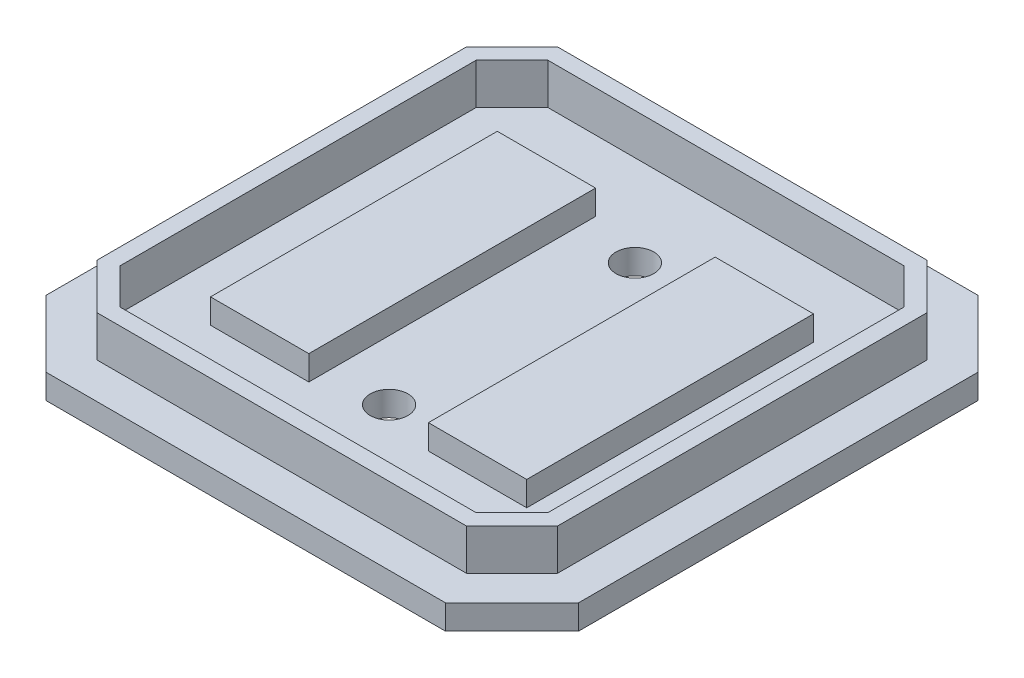
ISO-10303-21;
HEADER;
FILE_DESCRIPTION(('STEP AP214'),'2;1');
FILE_NAME('part.step','',(''),(''),'','','');
FILE_SCHEMA(('AUTOMOTIVE_DESIGN { 1 0 10303 214 1 1 1 1 }'));
ENDSEC;
DATA;
#1=APPLICATION_CONTEXT('core data for automotive mechanical design processes');
#2=APPLICATION_PROTOCOL_DEFINITION('international standard','automotive_design',2000,#1);
#3=PRODUCT_CONTEXT('',#1,'mechanical');
#4=PRODUCT('Part','Part','',(#3));
#5=PRODUCT_RELATED_PRODUCT_CATEGORY('part','',(#4));
#6=PRODUCT_DEFINITION_FORMATION('','',#4);
#7=PRODUCT_DEFINITION_CONTEXT('part definition',#1,'design');
#8=PRODUCT_DEFINITION('design','',#6,#7);
#9=PRODUCT_DEFINITION_SHAPE('','',#8);
#10=(LENGTH_UNIT() NAMED_UNIT(*) SI_UNIT(.MILLI.,.METRE.));
#11=(NAMED_UNIT(*) PLANE_ANGLE_UNIT() SI_UNIT($,.RADIAN.));
#12=(NAMED_UNIT(*) SI_UNIT($,.STERADIAN.) SOLID_ANGLE_UNIT());
#13=UNCERTAINTY_MEASURE_WITH_UNIT(LENGTH_MEASURE(1.E-05),#10,'distance_accuracy_value','');
#14=(GEOMETRIC_REPRESENTATION_CONTEXT(3) GLOBAL_UNCERTAINTY_ASSIGNED_CONTEXT((#13)) GLOBAL_UNIT_ASSIGNED_CONTEXT((#10,
#11,#12)) REPRESENTATION_CONTEXT('',''));
#15=CARTESIAN_POINT('',(0.,0.,0.));
#16=DIRECTION('',(0.,0.,1.));
#17=DIRECTION('',(1.,0.,0.));
#18=AXIS2_PLACEMENT_3D('',#15,#16,#17);
#19=CARTESIAN_POINT('',(0.,3.,0.));
#20=DIRECTION('',(0.,-1.,0.));
#21=DIRECTION('',(0.,0.,-1.));
#22=AXIS2_PLACEMENT_3D('',#19,#20,#21);
#23=PLANE('',#22);
#24=CARTESIAN_POINT('',(0.,3.,-15.));
#25=DIRECTION('',(0.,1.,0.));
#26=DIRECTION('',(0.,0.,1.));
#27=AXIS2_PLACEMENT_3D('',#24,#25,#26);
#28=CIRCLE('',#27,2.3);
#29=CARTESIAN_POINT('',(0.,3.,-12.7));
#30=VERTEX_POINT('',#29);
#31=EDGE_CURVE('E878',#30,#30,#28,.T.);
#32=ORIENTED_EDGE('',*,*,#31,.F.);
#33=EDGE_LOOP('',(#32));
#34=FACE_BOUND('',#33,.T.);
#35=CARTESIAN_POINT('',(0.,3.,15.));
#36=DIRECTION('',(0.,1.,0.));
#37=DIRECTION('',(0.,0.,1.));
#38=AXIS2_PLACEMENT_3D('',#35,#36,#37);
#39=CIRCLE('',#38,2.3);
#40=CARTESIAN_POINT('',(0.,3.,17.3));
#41=VERTEX_POINT('',#40);
#42=EDGE_CURVE('E883',#41,#41,#39,.T.);
#43=ORIENTED_EDGE('',*,*,#42,.F.);
#44=EDGE_LOOP('',(#43));
#45=FACE_BOUND('',#44,.T.);
#46=DIRECTION('',(1.,0.,0.));
#47=VECTOR('',#46,1.);
#48=CARTESIAN_POINT('',(19.296722284252,3.,-17.5));
#49=LINE('',#48,#47);
#50=CARTESIAN_POINT('',(7.29672228425205,3.,-17.5));
#51=VERTEX_POINT('',#50);
#52=CARTESIAN_POINT('',(19.296722284252,3.,-17.5));
#53=VERTEX_POINT('',#52);
#54=EDGE_CURVE('E276',#51,#53,#49,.T.);
#55=ORIENTED_EDGE('',*,*,#54,.T.);
#56=DIRECTION('',(0.,0.,1.));
#57=VECTOR('',#56,1.);
#58=CARTESIAN_POINT('',(19.296722284252,3.,-17.5));
#59=LINE('',#58,#57);
#60=CARTESIAN_POINT('',(19.296722284252,3.,17.5));
#61=VERTEX_POINT('',#60);
#62=EDGE_CURVE('E249',#53,#61,#59,.T.);
#63=ORIENTED_EDGE('',*,*,#62,.T.);
#64=DIRECTION('',(-1.,0.,0.));
#65=VECTOR('',#64,1.);
#66=CARTESIAN_POINT('',(19.296722284252,3.,17.5));
#67=LINE('',#66,#65);
#68=CARTESIAN_POINT('',(7.29672228425204,3.,17.5));
#69=VERTEX_POINT('',#68);
#70=EDGE_CURVE('E265',#61,#69,#67,.T.);
#71=ORIENTED_EDGE('',*,*,#70,.T.);
#72=DIRECTION('',(0.,0.,-1.));
#73=VECTOR('',#72,1.);
#74=CARTESIAN_POINT('',(7.29672228425205,3.,-17.5));
#75=LINE('',#74,#73);
#76=EDGE_CURVE('E50',#69,#51,#75,.T.);
#77=ORIENTED_EDGE('',*,*,#76,.T.);
#78=EDGE_LOOP('',(#55,#63,#71,#77));
#79=FACE_BOUND('',#78,.T.);
#80=DIRECTION('',(-1.,0.,0.));
#81=VECTOR('',#80,1.);
#82=CARTESIAN_POINT('',(0.,3.,-26.1));
#83=LINE('',#82,#81);
#84=CARTESIAN_POINT('',(21.7240332008121,3.,-26.1));
#85=VERTEX_POINT('',#84);
#86=CARTESIAN_POINT('',(-21.7240332008122,3.,-26.1));
#87=VERTEX_POINT('',#86);
#88=EDGE_CURVE('E361',#85,#87,#83,.T.);
#89=ORIENTED_EDGE('',*,*,#88,.T.);
#90=DIRECTION('',(-0.707106781186548,0.,0.707106781186548));
#91=VECTOR('',#90,1.);
#92=CARTESIAN_POINT('',(-23.9120166004061,3.,-23.9120166004061));
#93=LINE('',#92,#91);
#94=CARTESIAN_POINT('',(-26.1,3.,-21.7240332008122));
#95=VERTEX_POINT('',#94);
#96=EDGE_CURVE('E315',#87,#95,#93,.T.);
#97=ORIENTED_EDGE('',*,*,#96,.T.);
#98=DIRECTION('',(0.,0.,1.));
#99=VECTOR('',#98,1.);
#100=CARTESIAN_POINT('',(-26.1,3.,0.));
#101=LINE('',#100,#99);
#102=CARTESIAN_POINT('',(-26.1,3.,21.7240332008122));
#103=VERTEX_POINT('',#102);
#104=EDGE_CURVE('E379',#95,#103,#101,.T.);
#105=ORIENTED_EDGE('',*,*,#104,.T.);
#106=DIRECTION('',(0.707106781186548,0.,0.707106781186548));
#107=VECTOR('',#106,1.);
#108=CARTESIAN_POINT('',(-23.9120166004061,3.,23.9120166004061));
#109=LINE('',#108,#107);
#110=CARTESIAN_POINT('',(-21.7240332008122,3.,26.1));
#111=VERTEX_POINT('',#110);
#112=EDGE_CURVE('E376',#103,#111,#109,.T.);
#113=ORIENTED_EDGE('',*,*,#112,.T.);
#114=DIRECTION('',(1.,0.,0.));
#115=VECTOR('',#114,1.);
#116=CARTESIAN_POINT('',(0.,3.,26.1));
#117=LINE('',#116,#115);
#118=CARTESIAN_POINT('',(21.7240332008122,3.,26.1));
#119=VERTEX_POINT('',#118);
#120=EDGE_CURVE('E373',#111,#119,#117,.T.);
#121=ORIENTED_EDGE('',*,*,#120,.T.);
#122=DIRECTION('',(0.707106781186548,0.,-0.707106781186548));
#123=VECTOR('',#122,1.);
#124=CARTESIAN_POINT('',(23.9120166004061,3.,23.9120166004061));
#125=LINE('',#124,#123);
#126=CARTESIAN_POINT('',(26.1,3.,21.7240332008122));
#127=VERTEX_POINT('',#126);
#128=EDGE_CURVE('E370',#119,#127,#125,.T.);
#129=ORIENTED_EDGE('',*,*,#128,.T.);
#130=DIRECTION('',(0.,0.,-1.));
#131=VECTOR('',#130,1.);
#132=CARTESIAN_POINT('',(26.1,3.,0.));
#133=LINE('',#132,#131);
#134=CARTESIAN_POINT('',(26.1,3.,-21.7240332008122));
#135=VERTEX_POINT('',#134);
#136=EDGE_CURVE('E367',#127,#135,#133,.T.);
#137=ORIENTED_EDGE('',*,*,#136,.T.);
#138=DIRECTION('',(-0.707106781186548,0.,-0.707106781186547));
#139=VECTOR('',#138,1.);
#140=CARTESIAN_POINT('',(23.9120166004061,3.,-23.9120166004061));
#141=LINE('',#140,#139);
#142=EDGE_CURVE('E364',#135,#85,#141,.T.);
#143=ORIENTED_EDGE('',*,*,#142,.T.);
#144=EDGE_LOOP('',(#89,#97,#105,#113,#121,#129,#137,#143));
#145=FACE_BOUND('',#144,.T.);
#146=DIRECTION('',(0.,0.,1.));
#147=VECTOR('',#146,1.);
#148=CARTESIAN_POINT('',(-19.296722284252,3.,-17.5));
#149=LINE('',#148,#147);
#150=CARTESIAN_POINT('',(-19.296722284252,3.,-17.5));
#151=VERTEX_POINT('',#150);
#152=CARTESIAN_POINT('',(-19.296722284252,3.,17.5));
#153=VERTEX_POINT('',#152);
#154=EDGE_CURVE('E254',#151,#153,#149,.T.);
#155=ORIENTED_EDGE('',*,*,#154,.F.);
#156=DIRECTION('',(-1.,0.,0.));
#157=VECTOR('',#156,1.);
#158=CARTESIAN_POINT('',(-19.296722284252,3.,-17.5));
#159=LINE('',#158,#157);
#160=CARTESIAN_POINT('',(-7.29672228425205,3.,-17.5));
#161=VERTEX_POINT('',#160);
#162=EDGE_CURVE('E290',#161,#151,#159,.T.);
#163=ORIENTED_EDGE('',*,*,#162,.F.);
#164=DIRECTION('',(0.,0.,-1.));
#165=VECTOR('',#164,1.);
#166=CARTESIAN_POINT('',(-7.29672228425205,3.,-17.5));
#167=LINE('',#166,#165);
#168=CARTESIAN_POINT('',(-7.29672228425204,3.,17.5));
#169=VERTEX_POINT('',#168);
#170=EDGE_CURVE('E300',#169,#161,#167,.T.);
#171=ORIENTED_EDGE('',*,*,#170,.F.);
#172=DIRECTION('',(1.,0.,0.));
#173=VECTOR('',#172,1.);
#174=CARTESIAN_POINT('',(-19.296722284252,3.,17.5));
#175=LINE('',#174,#173);
#176=EDGE_CURVE('E58',#153,#169,#175,.T.);
#177=ORIENTED_EDGE('',*,*,#176,.F.);
#178=EDGE_LOOP('',(#155,#163,#171,#177));
#179=FACE_BOUND('',#178,.T.);
#180=ADVANCED_FACE('F35',(#34,#45,#79,#145,#179),#23,.F.);
#181=DIRECTION('',(0.,0.,1.));
#182=VECTOR('',#181,1.);
#183=CARTESIAN_POINT('',(-32.5,3.,32.5));
#184=LINE('',#183,#182);
#185=CARTESIAN_POINT('',(-32.5,3.,-24.375));
#186=VERTEX_POINT('',#185);
#187=CARTESIAN_POINT('',(-32.5,3.,24.375));
#188=VERTEX_POINT('',#187);
#189=EDGE_CURVE('E453',#186,#188,#184,.T.);
#190=ORIENTED_EDGE('',*,*,#189,.T.);
#191=DIRECTION('',(-0.707106781186546,0.,-0.707106781186549));
#192=VECTOR('',#191,1.);
#193=CARTESIAN_POINT('',(-24.375,3.,32.5));
#194=LINE('',#193,#192);
#195=CARTESIAN_POINT('',(-24.375,3.,32.5));
#196=VERTEX_POINT('',#195);
#197=EDGE_CURVE('E493',#188,#196,#194,.F.);
#198=ORIENTED_EDGE('',*,*,#197,.T.);
#199=DIRECTION('',(1.,0.,0.));
#200=VECTOR('',#199,1.);
#201=CARTESIAN_POINT('',(-32.5,3.,32.5));
#202=LINE('',#201,#200);
#203=CARTESIAN_POINT('',(24.375,3.,32.5));
#204=VERTEX_POINT('',#203);
#205=EDGE_CURVE('E456',#196,#204,#202,.T.);
#206=ORIENTED_EDGE('',*,*,#205,.T.);
#207=DIRECTION('',(-0.707106781186549,0.,0.707106781186546));
#208=VECTOR('',#207,1.);
#209=CARTESIAN_POINT('',(32.5,3.,24.375));
#210=LINE('',#209,#208);
#211=CARTESIAN_POINT('',(32.5,3.,24.375));
#212=VERTEX_POINT('',#211);
#213=EDGE_CURVE('E487',#204,#212,#210,.F.);
#214=ORIENTED_EDGE('',*,*,#213,.T.);
#215=DIRECTION('',(0.,0.,-1.));
#216=VECTOR('',#215,1.);
#217=CARTESIAN_POINT('',(32.5,3.,32.5));
#218=LINE('',#217,#216);
#219=CARTESIAN_POINT('',(32.5,3.,-24.375));
#220=VERTEX_POINT('',#219);
#221=EDGE_CURVE('E446',#212,#220,#218,.T.);
#222=ORIENTED_EDGE('',*,*,#221,.T.);
#223=DIRECTION('',(0.707106781186546,0.,0.707106781186549));
#224=VECTOR('',#223,1.);
#225=CARTESIAN_POINT('',(24.375,3.,-32.5));
#226=LINE('',#225,#224);
#227=CARTESIAN_POINT('',(24.375,3.,-32.5));
#228=VERTEX_POINT('',#227);
#229=EDGE_CURVE('E489',#220,#228,#226,.F.);
#230=ORIENTED_EDGE('',*,*,#229,.T.);
#231=DIRECTION('',(-1.,0.,0.));
#232=VECTOR('',#231,1.);
#233=CARTESIAN_POINT('',(-32.5,3.,-32.5));
#234=LINE('',#233,#232);
#235=CARTESIAN_POINT('',(-24.375,3.,-32.5));
#236=VERTEX_POINT('',#235);
#237=EDGE_CURVE('E449',#228,#236,#234,.T.);
#238=ORIENTED_EDGE('',*,*,#237,.T.);
#239=DIRECTION('',(0.707106781186549,0.,-0.707106781186546));
#240=VECTOR('',#239,1.);
#241=CARTESIAN_POINT('',(-32.5,3.,-24.375));
#242=LINE('',#241,#240);
#243=EDGE_CURVE('E491',#236,#186,#242,.F.);
#244=ORIENTED_EDGE('',*,*,#243,.T.);
#245=EDGE_LOOP('',(#190,#198,#206,#214,#222,#230,#238,#244));
#246=FACE_BOUND('',#245,.T.);
#247=DIRECTION('',(-1.,0.,0.));
#248=VECTOR('',#247,1.);
#249=CARTESIAN_POINT('',(0.,3.,-28.1));
#250=LINE('',#249,#248);
#251=CARTESIAN_POINT('',(22.5524603255583,3.,-28.1));
#252=VERTEX_POINT('',#251);
#253=CARTESIAN_POINT('',(-22.5524603255584,3.,-28.1));
#254=VERTEX_POINT('',#253);
#255=EDGE_CURVE('E382',#252,#254,#250,.T.);
#256=ORIENTED_EDGE('',*,*,#255,.F.);
#257=DIRECTION('',(-0.707106781186548,0.,-0.707106781186548));
#258=VECTOR('',#257,1.);
#259=CARTESIAN_POINT('',(25.3262301627792,3.,-25.3262301627792));
#260=LINE('',#259,#258);
#261=CARTESIAN_POINT('',(28.1,3.,-22.5524603255583));
#262=VERTEX_POINT('',#261);
#263=EDGE_CURVE('E320',#262,#252,#260,.T.);
#264=ORIENTED_EDGE('',*,*,#263,.F.);
#265=DIRECTION('',(0.,0.,-1.));
#266=VECTOR('',#265,1.);
#267=CARTESIAN_POINT('',(28.1,3.,0.));
#268=LINE('',#267,#266);
#269=CARTESIAN_POINT('',(28.1,3.,22.5524603255584));
#270=VERTEX_POINT('',#269);
#271=EDGE_CURVE('E400',#270,#262,#268,.T.);
#272=ORIENTED_EDGE('',*,*,#271,.F.);
#273=DIRECTION('',(0.707106781186547,0.,-0.707106781186548));
#274=VECTOR('',#273,1.);
#275=CARTESIAN_POINT('',(25.3262301627792,3.,25.3262301627792));
#276=LINE('',#275,#274);
#277=CARTESIAN_POINT('',(22.5524603255584,3.,28.1));
#278=VERTEX_POINT('',#277);
#279=EDGE_CURVE('E397',#278,#270,#276,.T.);
#280=ORIENTED_EDGE('',*,*,#279,.F.);
#281=DIRECTION('',(1.,0.,0.));
#282=VECTOR('',#281,1.);
#283=CARTESIAN_POINT('',(0.,3.,28.1));
#284=LINE('',#283,#282);
#285=CARTESIAN_POINT('',(-22.5524603255584,3.,28.1));
#286=VERTEX_POINT('',#285);
#287=EDGE_CURVE('E394',#286,#278,#284,.T.);
#288=ORIENTED_EDGE('',*,*,#287,.F.);
#289=DIRECTION('',(0.707106781186546,0.,0.707106781186549));
#290=VECTOR('',#289,1.);
#291=CARTESIAN_POINT('',(-25.3262301627792,3.,25.3262301627792));
#292=LINE('',#291,#290);
#293=CARTESIAN_POINT('',(-28.1,3.,22.5524603255584));
#294=VERTEX_POINT('',#293);
#295=EDGE_CURVE('E391',#294,#286,#292,.T.);
#296=ORIENTED_EDGE('',*,*,#295,.F.);
#297=DIRECTION('',(0.,0.,1.));
#298=VECTOR('',#297,1.);
#299=CARTESIAN_POINT('',(-28.1,3.,0.));
#300=LINE('',#299,#298);
#301=CARTESIAN_POINT('',(-28.1,3.,-22.5524603255583));
#302=VERTEX_POINT('',#301);
#303=EDGE_CURVE('E388',#302,#294,#300,.T.);
#304=ORIENTED_EDGE('',*,*,#303,.F.);
#305=DIRECTION('',(-0.707106781186547,0.,0.707106781186548));
#306=VECTOR('',#305,1.);
#307=CARTESIAN_POINT('',(-25.3262301627792,3.,-25.3262301627792));
#308=LINE('',#307,#306);
#309=EDGE_CURVE('E385',#254,#302,#308,.T.);
#310=ORIENTED_EDGE('',*,*,#309,.F.);
#311=EDGE_LOOP('',(#256,#264,#272,#280,#288,#296,#304,#310));
#312=FACE_BOUND('',#311,.T.);
#313=ADVANCED_FACE('F522',(#246,#312),#23,.F.);
#314=CARTESIAN_POINT('',(32.5,3.,32.5));
#315=DIRECTION('',(-1.,0.,0.));
#316=DIRECTION('',(0.,0.,1.));
#317=AXIS2_PLACEMENT_3D('',#314,#315,#316);
#318=PLANE('',#317);
#319=DIRECTION('',(0.,0.,-1.));
#320=VECTOR('',#319,1.);
#321=CARTESIAN_POINT('',(32.5,0.,32.5));
#322=LINE('',#321,#320);
#323=CARTESIAN_POINT('',(32.5,0.,24.375));
#324=VERTEX_POINT('',#323);
#325=CARTESIAN_POINT('',(32.5,0.,-24.375));
#326=VERTEX_POINT('',#325);
#327=EDGE_CURVE('E430',#324,#326,#322,.T.);
#328=ORIENTED_EDGE('',*,*,#327,.T.);
#329=DIRECTION('',(0.,1.,0.));
#330=VECTOR('',#329,1.);
#331=CARTESIAN_POINT('',(32.5,3.,-24.375));
#332=LINE('',#331,#330);
#333=EDGE_CURVE('E11',#326,#220,#332,.T.);
#334=ORIENTED_EDGE('',*,*,#333,.T.);
#335=ORIENTED_EDGE('',*,*,#221,.F.);
#336=DIRECTION('',(0.,-1.,0.));
#337=VECTOR('',#336,1.);
#338=CARTESIAN_POINT('',(32.5,3.,24.375));
#339=LINE('',#338,#337);
#340=EDGE_CURVE('E43',#212,#324,#339,.T.);
#341=ORIENTED_EDGE('',*,*,#340,.T.);
#342=EDGE_LOOP('',(#328,#334,#335,#341));
#343=FACE_BOUND('',#342,.T.);
#344=ADVANCED_FACE('F504',(#343),#318,.F.);
#345=CARTESIAN_POINT('',(-32.5,3.,-32.5));
#346=DIRECTION('',(0.,0.,1.));
#347=DIRECTION('',(1.,0.,0.));
#348=AXIS2_PLACEMENT_3D('',#345,#346,#347);
#349=PLANE('',#348);
#350=DIRECTION('',(-1.,0.,0.));
#351=VECTOR('',#350,1.);
#352=CARTESIAN_POINT('',(-32.5,0.,-32.5));
#353=LINE('',#352,#351);
#354=CARTESIAN_POINT('',(24.375,0.,-32.5));
#355=VERTEX_POINT('',#354);
#356=CARTESIAN_POINT('',(-24.375,0.,-32.5));
#357=VERTEX_POINT('',#356);
#358=EDGE_CURVE('E462',#355,#357,#353,.T.);
#359=ORIENTED_EDGE('',*,*,#358,.T.);
#360=DIRECTION('',(0.,1.,0.));
#361=VECTOR('',#360,1.);
#362=CARTESIAN_POINT('',(-24.375,3.,-32.5));
#363=LINE('',#362,#361);
#364=EDGE_CURVE('E498',#357,#236,#363,.T.);
#365=ORIENTED_EDGE('',*,*,#364,.T.);
#366=ORIENTED_EDGE('',*,*,#237,.F.);
#367=DIRECTION('',(0.,-1.,0.));
#368=VECTOR('',#367,1.);
#369=CARTESIAN_POINT('',(24.375,3.,-32.5));
#370=LINE('',#369,#368);
#371=EDGE_CURVE('E495',#228,#355,#370,.T.);
#372=ORIENTED_EDGE('',*,*,#371,.T.);
#373=EDGE_LOOP('',(#359,#365,#366,#372));
#374=FACE_BOUND('',#373,.T.);
#375=ADVANCED_FACE('F518',(#374),#349,.F.);
#376=CARTESIAN_POINT('',(-32.5,3.,32.5));
#377=DIRECTION('',(1.,0.,0.));
#378=DIRECTION('',(0.,0.,-1.));
#379=AXIS2_PLACEMENT_3D('',#376,#377,#378);
#380=PLANE('',#379);
#381=DIRECTION('',(0.,0.,1.));
#382=VECTOR('',#381,1.);
#383=CARTESIAN_POINT('',(-32.5,0.,32.5));
#384=LINE('',#383,#382);
#385=CARTESIAN_POINT('',(-32.5,0.,-24.375));
#386=VERTEX_POINT('',#385);
#387=CARTESIAN_POINT('',(-32.5,0.,24.375));
#388=VERTEX_POINT('',#387);
#389=EDGE_CURVE('E465',#386,#388,#384,.T.);
#390=ORIENTED_EDGE('',*,*,#389,.T.);
#391=DIRECTION('',(0.,1.,0.));
#392=VECTOR('',#391,1.);
#393=CARTESIAN_POINT('',(-32.5,3.,24.375));
#394=LINE('',#393,#392);
#395=EDGE_CURVE('E485',#388,#188,#394,.T.);
#396=ORIENTED_EDGE('',*,*,#395,.T.);
#397=ORIENTED_EDGE('',*,*,#189,.F.);
#398=DIRECTION('',(0.,-1.,0.));
#399=VECTOR('',#398,1.);
#400=CARTESIAN_POINT('',(-32.5,3.,-24.375));
#401=LINE('',#400,#399);
#402=EDGE_CURVE('E482',#186,#386,#401,.T.);
#403=ORIENTED_EDGE('',*,*,#402,.T.);
#404=EDGE_LOOP('',(#390,#396,#397,#403));
#405=FACE_BOUND('',#404,.T.);
#406=ADVANCED_FACE('F530',(#405),#380,.F.);
#407=CARTESIAN_POINT('',(-32.5,3.,32.5));
#408=DIRECTION('',(0.,0.,-1.));
#409=DIRECTION('',(-1.,0.,0.));
#410=AXIS2_PLACEMENT_3D('',#407,#408,#409);
#411=PLANE('',#410);
#412=ORIENTED_EDGE('',*,*,#205,.F.);
#413=DIRECTION('',(0.,-1.,0.));
#414=VECTOR('',#413,1.);
#415=CARTESIAN_POINT('',(-24.375,3.,32.5));
#416=LINE('',#415,#414);
#417=CARTESIAN_POINT('',(-24.375,0.,32.5));
#418=VERTEX_POINT('',#417);
#419=EDGE_CURVE('E471',#196,#418,#416,.T.);
#420=ORIENTED_EDGE('',*,*,#419,.T.);
#421=DIRECTION('',(1.,0.,0.));
#422=VECTOR('',#421,1.);
#423=CARTESIAN_POINT('',(-32.5,0.,32.5));
#424=LINE('',#423,#422);
#425=CARTESIAN_POINT('',(24.375,0.,32.5));
#426=VERTEX_POINT('',#425);
#427=EDGE_CURVE('E450',#418,#426,#424,.T.);
#428=ORIENTED_EDGE('',*,*,#427,.T.);
#429=DIRECTION('',(0.,1.,0.));
#430=VECTOR('',#429,1.);
#431=CARTESIAN_POINT('',(24.375,3.,32.5));
#432=LINE('',#431,#430);
#433=EDGE_CURVE('E459',#426,#204,#432,.T.);
#434=ORIENTED_EDGE('',*,*,#433,.T.);
#435=EDGE_LOOP('',(#412,#420,#428,#434));
#436=FACE_BOUND('',#435,.T.);
#437=ADVANCED_FACE('F538',(#436),#411,.F.);
#438=CARTESIAN_POINT('',(0.,0.,0.));
#439=DIRECTION('',(0.,-1.,0.));
#440=DIRECTION('',(0.,0.,-1.));
#441=AXIS2_PLACEMENT_3D('',#438,#439,#440);
#442=PLANE('',#441);
#443=CARTESIAN_POINT('',(0.,0.,-15.));
#444=DIRECTION('',(0.,1.,0.));
#445=DIRECTION('',(0.,0.,1.));
#446=AXIS2_PLACEMENT_3D('',#443,#444,#445);
#447=CIRCLE('',#446,2.3);
#448=CARTESIAN_POINT('',(0.,0.,-12.7));
#449=VERTEX_POINT('',#448);
#450=EDGE_CURVE('E277',#449,#449,#447,.T.);
#451=ORIENTED_EDGE('',*,*,#450,.T.);
#452=EDGE_LOOP('',(#451));
#453=FACE_BOUND('',#452,.T.);
#454=CARTESIAN_POINT('',(0.,0.,15.));
#455=DIRECTION('',(0.,1.,0.));
#456=DIRECTION('',(0.,0.,1.));
#457=AXIS2_PLACEMENT_3D('',#454,#455,#456);
#458=CIRCLE('',#457,2.3);
#459=CARTESIAN_POINT('',(0.,0.,17.3));
#460=VERTEX_POINT('',#459);
#461=EDGE_CURVE('E879',#460,#460,#458,.T.);
#462=ORIENTED_EDGE('',*,*,#461,.T.);
#463=EDGE_LOOP('',(#462));
#464=FACE_BOUND('',#463,.T.);
#465=ORIENTED_EDGE('',*,*,#427,.F.);
#466=DIRECTION('',(0.707106781186546,0.,0.707106781186549));
#467=VECTOR('',#466,1.);
#468=CARTESIAN_POINT('',(-28.4375000000001,0.,28.4375));
#469=LINE('',#468,#467);
#470=EDGE_CURVE('E480',#418,#388,#469,.F.);
#471=ORIENTED_EDGE('',*,*,#470,.T.);
#472=ORIENTED_EDGE('',*,*,#389,.F.);
#473=DIRECTION('',(-0.707106781186549,0.,0.707106781186546));
#474=VECTOR('',#473,1.);
#475=CARTESIAN_POINT('',(-28.4374999999999,0.,-28.4375));
#476=LINE('',#475,#474);
#477=EDGE_CURVE('E478',#386,#357,#476,.F.);
#478=ORIENTED_EDGE('',*,*,#477,.T.);
#479=ORIENTED_EDGE('',*,*,#358,.F.);
#480=DIRECTION('',(-0.707106781186546,0.,-0.707106781186549));
#481=VECTOR('',#480,1.);
#482=CARTESIAN_POINT('',(28.4375,0.,-28.4374999999999));
#483=LINE('',#482,#481);
#484=EDGE_CURVE('E476',#355,#326,#483,.F.);
#485=ORIENTED_EDGE('',*,*,#484,.T.);
#486=ORIENTED_EDGE('',*,*,#327,.F.);
#487=DIRECTION('',(0.707106781186549,0.,-0.707106781186546));
#488=VECTOR('',#487,1.);
#489=CARTESIAN_POINT('',(28.4374999999999,0.,28.4375));
#490=LINE('',#489,#488);
#491=EDGE_CURVE('E474',#324,#426,#490,.F.);
#492=ORIENTED_EDGE('',*,*,#491,.T.);
#493=EDGE_LOOP('',(#465,#471,#472,#478,#479,#485,#486,#492));
#494=FACE_BOUND('',#493,.T.);
#495=ADVANCED_FACE('F510',(#453,#464,#494),#442,.T.);
#496=CARTESIAN_POINT('',(-24.375,3.,32.5));
#497=DIRECTION('',(0.707106781186549,0.,-0.707106781186546));
#498=DIRECTION('',(0.,-1.,0.));
#499=AXIS2_PLACEMENT_3D('',#496,#497,#498);
#500=PLANE('',#499);
#501=ORIENTED_EDGE('',*,*,#197,.F.);
#502=ORIENTED_EDGE('',*,*,#395,.F.);
#503=ORIENTED_EDGE('',*,*,#470,.F.);
#504=ORIENTED_EDGE('',*,*,#419,.F.);
#505=EDGE_LOOP('',(#501,#502,#503,#504));
#506=FACE_BOUND('',#505,.T.);
#507=ADVANCED_FACE('F535',(#506),#500,.F.);
#508=CARTESIAN_POINT('',(-32.5,3.,-24.375));
#509=DIRECTION('',(0.707106781186546,0.,0.707106781186549));
#510=DIRECTION('',(0.,-1.,0.));
#511=AXIS2_PLACEMENT_3D('',#508,#509,#510);
#512=PLANE('',#511);
#513=ORIENTED_EDGE('',*,*,#243,.F.);
#514=ORIENTED_EDGE('',*,*,#364,.F.);
#515=ORIENTED_EDGE('',*,*,#477,.F.);
#516=ORIENTED_EDGE('',*,*,#402,.F.);
#517=EDGE_LOOP('',(#513,#514,#515,#516));
#518=FACE_BOUND('',#517,.T.);
#519=ADVANCED_FACE('F527',(#518),#512,.F.);
#520=CARTESIAN_POINT('',(24.375,3.,-32.5));
#521=DIRECTION('',(-0.707106781186549,0.,0.707106781186546));
#522=DIRECTION('',(0.,-1.,0.));
#523=AXIS2_PLACEMENT_3D('',#520,#521,#522);
#524=PLANE('',#523);
#525=ORIENTED_EDGE('',*,*,#229,.F.);
#526=ORIENTED_EDGE('',*,*,#333,.F.);
#527=ORIENTED_EDGE('',*,*,#484,.F.);
#528=ORIENTED_EDGE('',*,*,#371,.F.);
#529=EDGE_LOOP('',(#525,#526,#527,#528));
#530=FACE_BOUND('',#529,.T.);
#531=ADVANCED_FACE('F515',(#530),#524,.F.);
#532=CARTESIAN_POINT('',(32.5,3.,24.375));
#533=DIRECTION('',(-0.707106781186546,0.,-0.707106781186549));
#534=DIRECTION('',(0.,-1.,0.));
#535=AXIS2_PLACEMENT_3D('',#532,#533,#534);
#536=PLANE('',#535);
#537=ORIENTED_EDGE('',*,*,#213,.F.);
#538=ORIENTED_EDGE('',*,*,#433,.F.);
#539=ORIENTED_EDGE('',*,*,#491,.F.);
#540=ORIENTED_EDGE('',*,*,#340,.F.);
#541=EDGE_LOOP('',(#537,#538,#539,#540));
#542=FACE_BOUND('',#541,.T.);
#543=ADVANCED_FACE('F37',(#542),#536,.F.);
#544=CARTESIAN_POINT('',(0.,8.,-28.1));
#545=DIRECTION('',(0.,0.,1.));
#546=DIRECTION('',(1.,0.,0.));
#547=AXIS2_PLACEMENT_3D('',#544,#545,#546);
#548=PLANE('',#547);
#549=ORIENTED_EDGE('',*,*,#255,.T.);
#550=DIRECTION('',(0.,-1.,0.));
#551=VECTOR('',#550,1.);
#552=CARTESIAN_POINT('',(-22.5524603255584,8.,-28.1));
#553=LINE('',#552,#551);
#554=CARTESIAN_POINT('',(-22.5524603255584,8.,-28.1));
#555=VERTEX_POINT('',#554);
#556=EDGE_CURVE('E427',#555,#254,#553,.T.);
#557=ORIENTED_EDGE('',*,*,#556,.F.);
#558=DIRECTION('',(-1.,0.,0.));
#559=VECTOR('',#558,1.);
#560=CARTESIAN_POINT('',(0.,8.,-28.1));
#561=LINE('',#560,#559);
#562=CARTESIAN_POINT('',(22.5524603255583,8.,-28.1));
#563=VERTEX_POINT('',#562);
#564=EDGE_CURVE('E341',#563,#555,#561,.T.);
#565=ORIENTED_EDGE('',*,*,#564,.F.);
#566=DIRECTION('',(0.,-1.,0.));
#567=VECTOR('',#566,1.);
#568=CARTESIAN_POINT('',(22.5524603255583,8.,-28.1));
#569=LINE('',#568,#567);
#570=EDGE_CURVE('E405',#563,#252,#569,.T.);
#571=ORIENTED_EDGE('',*,*,#570,.T.);
#572=EDGE_LOOP('',(#549,#557,#565,#571));
#573=FACE_BOUND('',#572,.T.);
#574=ADVANCED_FACE('F541',(#573),#548,.F.);
#575=CARTESIAN_POINT('',(-25.3262301627792,8.,-25.3262301627792));
#576=DIRECTION('',(0.707106781186548,0.,0.707106781186547));
#577=DIRECTION('',(0.707106781186547,0.,-0.707106781186548));
#578=AXIS2_PLACEMENT_3D('',#575,#576,#577);
#579=PLANE('',#578);
#580=ORIENTED_EDGE('',*,*,#309,.T.);
#581=DIRECTION('',(0.,-1.,0.));
#582=VECTOR('',#581,1.);
#583=CARTESIAN_POINT('',(-28.1,8.,-22.5524603255583));
#584=LINE('',#583,#582);
#585=CARTESIAN_POINT('',(-28.1,8.,-22.5524603255583));
#586=VERTEX_POINT('',#585);
#587=EDGE_CURVE('E424',#586,#302,#584,.T.);
#588=ORIENTED_EDGE('',*,*,#587,.F.);
#589=DIRECTION('',(-0.707106781186547,0.,0.707106781186548));
#590=VECTOR('',#589,1.);
#591=CARTESIAN_POINT('',(-25.3262301627792,8.,-25.3262301627792));
#592=LINE('',#591,#590);
#593=EDGE_CURVE('E344',#555,#586,#592,.T.);
#594=ORIENTED_EDGE('',*,*,#593,.F.);
#595=ORIENTED_EDGE('',*,*,#556,.T.);
#596=EDGE_LOOP('',(#580,#588,#594,#595));
#597=FACE_BOUND('',#596,.T.);
#598=ADVANCED_FACE('F547',(#597),#579,.F.);
#599=CARTESIAN_POINT('',(-28.1,8.,0.));
#600=DIRECTION('',(1.,0.,0.));
#601=DIRECTION('',(0.,0.,-1.));
#602=AXIS2_PLACEMENT_3D('',#599,#600,#601);
#603=PLANE('',#602);
#604=ORIENTED_EDGE('',*,*,#303,.T.);
#605=DIRECTION('',(0.,-1.,0.));
#606=VECTOR('',#605,1.);
#607=CARTESIAN_POINT('',(-28.1,8.,22.5524603255584));
#608=LINE('',#607,#606);
#609=CARTESIAN_POINT('',(-28.1,8.,22.5524603255584));
#610=VERTEX_POINT('',#609);
#611=EDGE_CURVE('E421',#610,#294,#608,.T.);
#612=ORIENTED_EDGE('',*,*,#611,.F.);
#613=DIRECTION('',(0.,0.,1.));
#614=VECTOR('',#613,1.);
#615=CARTESIAN_POINT('',(-28.1,8.,0.));
#616=LINE('',#615,#614);
#617=EDGE_CURVE('E346',#586,#610,#616,.T.);
#618=ORIENTED_EDGE('',*,*,#617,.F.);
#619=ORIENTED_EDGE('',*,*,#587,.T.);
#620=EDGE_LOOP('',(#604,#612,#618,#619));
#621=FACE_BOUND('',#620,.T.);
#622=ADVANCED_FACE('F610',(#621),#603,.F.);
#623=CARTESIAN_POINT('',(-25.3262301627792,8.,25.3262301627792));
#624=DIRECTION('',(0.707106781186549,0.,-0.707106781186546));
#625=DIRECTION('',(-0.707106781186546,0.,-0.707106781186549));
#626=AXIS2_PLACEMENT_3D('',#623,#624,#625);
#627=PLANE('',#626);
#628=ORIENTED_EDGE('',*,*,#295,.T.);
#629=DIRECTION('',(0.,-1.,0.));
#630=VECTOR('',#629,1.);
#631=CARTESIAN_POINT('',(-22.5524603255584,8.,28.1));
#632=LINE('',#631,#630);
#633=CARTESIAN_POINT('',(-22.5524603255584,8.,28.1));
#634=VERTEX_POINT('',#633);
#635=EDGE_CURVE('E418',#634,#286,#632,.T.);
#636=ORIENTED_EDGE('',*,*,#635,.F.);
#637=DIRECTION('',(0.707106781186546,0.,0.707106781186549));
#638=VECTOR('',#637,1.);
#639=CARTESIAN_POINT('',(-25.3262301627792,8.,25.3262301627792));
#640=LINE('',#639,#638);
#641=EDGE_CURVE('E348',#610,#634,#640,.T.);
#642=ORIENTED_EDGE('',*,*,#641,.F.);
#643=ORIENTED_EDGE('',*,*,#611,.T.);
#644=EDGE_LOOP('',(#628,#636,#642,#643));
#645=FACE_BOUND('',#644,.T.);
#646=ADVANCED_FACE('F620',(#645),#627,.F.);
#647=CARTESIAN_POINT('',(0.,8.,28.1));
#648=DIRECTION('',(0.,0.,-1.));
#649=DIRECTION('',(-1.,0.,0.));
#650=AXIS2_PLACEMENT_3D('',#647,#648,#649);
#651=PLANE('',#650);
#652=ORIENTED_EDGE('',*,*,#287,.T.);
#653=DIRECTION('',(0.,-1.,0.));
#654=VECTOR('',#653,1.);
#655=CARTESIAN_POINT('',(22.5524603255584,8.,28.1));
#656=LINE('',#655,#654);
#657=CARTESIAN_POINT('',(22.5524603255584,8.,28.1));
#658=VERTEX_POINT('',#657);
#659=EDGE_CURVE('E415',#658,#278,#656,.T.);
#660=ORIENTED_EDGE('',*,*,#659,.F.);
#661=DIRECTION('',(1.,0.,0.));
#662=VECTOR('',#661,1.);
#663=CARTESIAN_POINT('',(0.,8.,28.1));
#664=LINE('',#663,#662);
#665=EDGE_CURVE('E350',#634,#658,#664,.T.);
#666=ORIENTED_EDGE('',*,*,#665,.F.);
#667=ORIENTED_EDGE('',*,*,#635,.T.);
#668=EDGE_LOOP('',(#652,#660,#666,#667));
#669=FACE_BOUND('',#668,.T.);
#670=ADVANCED_FACE('F630',(#669),#651,.F.);
#671=CARTESIAN_POINT('',(25.3262301627792,8.,25.3262301627792));
#672=DIRECTION('',(-0.707106781186548,0.,-0.707106781186547));
#673=DIRECTION('',(-0.707106781186547,0.,0.707106781186548));
#674=AXIS2_PLACEMENT_3D('',#671,#672,#673);
#675=PLANE('',#674);
#676=ORIENTED_EDGE('',*,*,#279,.T.);
#677=DIRECTION('',(0.,-1.,0.));
#678=VECTOR('',#677,1.);
#679=CARTESIAN_POINT('',(28.1,8.,22.5524603255584));
#680=LINE('',#679,#678);
#681=CARTESIAN_POINT('',(28.1,8.,22.5524603255584));
#682=VERTEX_POINT('',#681);
#683=EDGE_CURVE('E412',#682,#270,#680,.T.);
#684=ORIENTED_EDGE('',*,*,#683,.F.);
#685=DIRECTION('',(0.707106781186547,0.,-0.707106781186548));
#686=VECTOR('',#685,1.);
#687=CARTESIAN_POINT('',(25.3262301627792,8.,25.3262301627792));
#688=LINE('',#687,#686);
#689=EDGE_CURVE('E352',#658,#682,#688,.T.);
#690=ORIENTED_EDGE('',*,*,#689,.F.);
#691=ORIENTED_EDGE('',*,*,#659,.T.);
#692=EDGE_LOOP('',(#676,#684,#690,#691));
#693=FACE_BOUND('',#692,.T.);
#694=ADVANCED_FACE('F640',(#693),#675,.F.);
#695=CARTESIAN_POINT('',(28.1,8.,0.));
#696=DIRECTION('',(-1.,0.,0.));
#697=DIRECTION('',(0.,0.,1.));
#698=AXIS2_PLACEMENT_3D('',#695,#696,#697);
#699=PLANE('',#698);
#700=ORIENTED_EDGE('',*,*,#271,.T.);
#701=DIRECTION('',(0.,-1.,0.));
#702=VECTOR('',#701,1.);
#703=CARTESIAN_POINT('',(28.1,8.,-22.5524603255583));
#704=LINE('',#703,#702);
#705=CARTESIAN_POINT('',(28.1,8.,-22.5524603255583));
#706=VERTEX_POINT('',#705);
#707=EDGE_CURVE('E408',#706,#262,#704,.T.);
#708=ORIENTED_EDGE('',*,*,#707,.F.);
#709=DIRECTION('',(0.,0.,-1.));
#710=VECTOR('',#709,1.);
#711=CARTESIAN_POINT('',(28.1,8.,0.));
#712=LINE('',#711,#710);
#713=EDGE_CURVE('E354',#682,#706,#712,.T.);
#714=ORIENTED_EDGE('',*,*,#713,.F.);
#715=ORIENTED_EDGE('',*,*,#683,.T.);
#716=EDGE_LOOP('',(#700,#708,#714,#715));
#717=FACE_BOUND('',#716,.T.);
#718=ADVANCED_FACE('F650',(#717),#699,.F.);
#719=CARTESIAN_POINT('',(-23.9120166004061,8.,-23.9120166004061));
#720=DIRECTION('',(0.707106781186548,0.,0.707106781186548));
#721=DIRECTION('',(0.707106781186548,0.,-0.707106781186548));
#722=AXIS2_PLACEMENT_3D('',#719,#720,#721);
#723=PLANE('',#722);
#724=ORIENTED_EDGE('',*,*,#96,.F.);
#725=DIRECTION('',(0.,-1.,0.));
#726=VECTOR('',#725,1.);
#727=CARTESIAN_POINT('',(-21.7240332008122,8.,-26.1));
#728=LINE('',#727,#726);
#729=CARTESIAN_POINT('',(-21.7240332008122,8.,-26.1));
#730=VERTEX_POINT('',#729);
#731=EDGE_CURVE('E409',#730,#87,#728,.T.);
#732=ORIENTED_EDGE('',*,*,#731,.F.);
#733=DIRECTION('',(-0.707106781186548,0.,0.707106781186548));
#734=VECTOR('',#733,1.);
#735=CARTESIAN_POINT('',(-23.9120166004061,8.,-23.9120166004061));
#736=LINE('',#735,#734);
#737=CARTESIAN_POINT('',(-26.1,8.,-21.7240332008122));
#738=VERTEX_POINT('',#737);
#739=EDGE_CURVE('E316',#730,#738,#736,.T.);
#740=ORIENTED_EDGE('',*,*,#739,.T.);
#741=DIRECTION('',(0.,-1.,0.));
#742=VECTOR('',#741,1.);
#743=CARTESIAN_POINT('',(-26.1,8.,-21.7240332008122));
#744=LINE('',#743,#742);
#745=EDGE_CURVE('E358',#738,#95,#744,.T.);
#746=ORIENTED_EDGE('',*,*,#745,.T.);
#747=EDGE_LOOP('',(#724,#732,#740,#746));
#748=FACE_BOUND('',#747,.T.);
#749=ADVANCED_FACE('F562',(#748),#723,.T.);
#750=CARTESIAN_POINT('',(0.,8.,-26.1));
#751=DIRECTION('',(0.,0.,1.));
#752=DIRECTION('',(1.,0.,0.));
#753=AXIS2_PLACEMENT_3D('',#750,#751,#752);
#754=PLANE('',#753);
#755=ORIENTED_EDGE('',*,*,#88,.F.);
#756=DIRECTION('',(0.,-1.,0.));
#757=VECTOR('',#756,1.);
#758=CARTESIAN_POINT('',(21.7240332008121,8.,-26.1));
#759=LINE('',#758,#757);
#760=CARTESIAN_POINT('',(21.7240332008121,8.,-26.1));
#761=VERTEX_POINT('',#760);
#762=EDGE_CURVE('E443',#761,#85,#759,.T.);
#763=ORIENTED_EDGE('',*,*,#762,.F.);
#764=DIRECTION('',(-1.,0.,0.));
#765=VECTOR('',#764,1.);
#766=CARTESIAN_POINT('',(0.,8.,-26.1));
#767=LINE('',#766,#765);
#768=EDGE_CURVE('E319',#761,#730,#767,.T.);
#769=ORIENTED_EDGE('',*,*,#768,.T.);
#770=ORIENTED_EDGE('',*,*,#731,.T.);
#771=EDGE_LOOP('',(#755,#763,#769,#770));
#772=FACE_BOUND('',#771,.T.);
#773=ADVANCED_FACE('F669',(#772),#754,.T.);
#774=CARTESIAN_POINT('',(23.9120166004061,8.,-23.9120166004061));
#775=DIRECTION('',(-0.707106781186547,0.,0.707106781186548));
#776=DIRECTION('',(0.707106781186548,0.,0.707106781186547));
#777=AXIS2_PLACEMENT_3D('',#774,#775,#776);
#778=PLANE('',#777);
#779=ORIENTED_EDGE('',*,*,#142,.F.);
#780=DIRECTION('',(0.,-1.,0.));
#781=VECTOR('',#780,1.);
#782=CARTESIAN_POINT('',(26.1,8.,-21.7240332008122));
#783=LINE('',#782,#781);
#784=CARTESIAN_POINT('',(26.1,8.,-21.7240332008122));
#785=VERTEX_POINT('',#784);
#786=EDGE_CURVE('E441',#785,#135,#783,.T.);
#787=ORIENTED_EDGE('',*,*,#786,.F.);
#788=DIRECTION('',(-0.707106781186548,0.,-0.707106781186547));
#789=VECTOR('',#788,1.);
#790=CARTESIAN_POINT('',(23.9120166004061,8.,-23.9120166004061));
#791=LINE('',#790,#789);
#792=EDGE_CURVE('E323',#785,#761,#791,.T.);
#793=ORIENTED_EDGE('',*,*,#792,.T.);
#794=ORIENTED_EDGE('',*,*,#762,.T.);
#795=EDGE_LOOP('',(#779,#787,#793,#794));
#796=FACE_BOUND('',#795,.T.);
#797=ADVANCED_FACE('F678',(#796),#778,.T.);
#798=CARTESIAN_POINT('',(26.1,8.,0.));
#799=DIRECTION('',(-1.,0.,0.));
#800=DIRECTION('',(0.,0.,1.));
#801=AXIS2_PLACEMENT_3D('',#798,#799,#800);
#802=PLANE('',#801);
#803=ORIENTED_EDGE('',*,*,#136,.F.);
#804=DIRECTION('',(0.,-1.,0.));
#805=VECTOR('',#804,1.);
#806=CARTESIAN_POINT('',(26.1,8.,21.7240332008122));
#807=LINE('',#806,#805);
#808=CARTESIAN_POINT('',(26.1,8.,21.7240332008122));
#809=VERTEX_POINT('',#808);
#810=EDGE_CURVE('E439',#809,#127,#807,.T.);
#811=ORIENTED_EDGE('',*,*,#810,.F.);
#812=DIRECTION('',(0.,0.,-1.));
#813=VECTOR('',#812,1.);
#814=CARTESIAN_POINT('',(26.1,8.,0.));
#815=LINE('',#814,#813);
#816=EDGE_CURVE('E326',#809,#785,#815,.T.);
#817=ORIENTED_EDGE('',*,*,#816,.T.);
#818=ORIENTED_EDGE('',*,*,#786,.T.);
#819=EDGE_LOOP('',(#803,#811,#817,#818));
#820=FACE_BOUND('',#819,.T.);
#821=ADVANCED_FACE('F687',(#820),#802,.T.);
#822=CARTESIAN_POINT('',(23.9120166004061,8.,23.9120166004061));
#823=DIRECTION('',(-0.707106781186548,0.,-0.707106781186548));
#824=DIRECTION('',(-0.707106781186548,0.,0.707106781186548));
#825=AXIS2_PLACEMENT_3D('',#822,#823,#824);
#826=PLANE('',#825);
#827=ORIENTED_EDGE('',*,*,#128,.F.);
#828=DIRECTION('',(0.,-1.,0.));
#829=VECTOR('',#828,1.);
#830=CARTESIAN_POINT('',(21.7240332008122,8.,26.1));
#831=LINE('',#830,#829);
#832=CARTESIAN_POINT('',(21.7240332008122,8.,26.1));
#833=VERTEX_POINT('',#832);
#834=EDGE_CURVE('E437',#833,#119,#831,.T.);
#835=ORIENTED_EDGE('',*,*,#834,.F.);
#836=DIRECTION('',(0.707106781186548,0.,-0.707106781186548));
#837=VECTOR('',#836,1.);
#838=CARTESIAN_POINT('',(23.9120166004061,8.,23.9120166004061));
#839=LINE('',#838,#837);
#840=EDGE_CURVE('E329',#833,#809,#839,.T.);
#841=ORIENTED_EDGE('',*,*,#840,.T.);
#842=ORIENTED_EDGE('',*,*,#810,.T.);
#843=EDGE_LOOP('',(#827,#835,#841,#842));
#844=FACE_BOUND('',#843,.T.);
#845=ADVANCED_FACE('F697',(#844),#826,.T.);
#846=CARTESIAN_POINT('',(0.,8.,26.1));
#847=DIRECTION('',(0.,0.,-1.));
#848=DIRECTION('',(-1.,0.,0.));
#849=AXIS2_PLACEMENT_3D('',#846,#847,#848);
#850=PLANE('',#849);
#851=ORIENTED_EDGE('',*,*,#120,.F.);
#852=DIRECTION('',(0.,-1.,0.));
#853=VECTOR('',#852,1.);
#854=CARTESIAN_POINT('',(-21.7240332008122,8.,26.1));
#855=LINE('',#854,#853);
#856=CARTESIAN_POINT('',(-21.7240332008122,8.,26.1));
#857=VERTEX_POINT('',#856);
#858=EDGE_CURVE('E435',#857,#111,#855,.T.);
#859=ORIENTED_EDGE('',*,*,#858,.F.);
#860=DIRECTION('',(1.,0.,0.));
#861=VECTOR('',#860,1.);
#862=CARTESIAN_POINT('',(0.,8.,26.1));
#863=LINE('',#862,#861);
#864=EDGE_CURVE('E332',#857,#833,#863,.T.);
#865=ORIENTED_EDGE('',*,*,#864,.T.);
#866=ORIENTED_EDGE('',*,*,#834,.T.);
#867=EDGE_LOOP('',(#851,#859,#865,#866));
#868=FACE_BOUND('',#867,.T.);
#869=ADVANCED_FACE('F707',(#868),#850,.T.);
#870=CARTESIAN_POINT('',(-23.9120166004061,8.,23.9120166004061));
#871=DIRECTION('',(0.707106781186548,0.,-0.707106781186548));
#872=DIRECTION('',(-0.707106781186548,0.,-0.707106781186548));
#873=AXIS2_PLACEMENT_3D('',#870,#871,#872);
#874=PLANE('',#873);
#875=ORIENTED_EDGE('',*,*,#112,.F.);
#876=DIRECTION('',(0.,-1.,0.));
#877=VECTOR('',#876,1.);
#878=CARTESIAN_POINT('',(-26.1,8.,21.7240332008122));
#879=LINE('',#878,#877);
#880=CARTESIAN_POINT('',(-26.1,8.,21.7240332008122));
#881=VERTEX_POINT('',#880);
#882=EDGE_CURVE('E432',#881,#103,#879,.T.);
#883=ORIENTED_EDGE('',*,*,#882,.F.);
#884=DIRECTION('',(0.707106781186548,0.,0.707106781186548));
#885=VECTOR('',#884,1.);
#886=CARTESIAN_POINT('',(-23.9120166004061,8.,23.9120166004061));
#887=LINE('',#886,#885);
#888=EDGE_CURVE('E335',#881,#857,#887,.T.);
#889=ORIENTED_EDGE('',*,*,#888,.T.);
#890=ORIENTED_EDGE('',*,*,#858,.T.);
#891=EDGE_LOOP('',(#875,#883,#889,#890));
#892=FACE_BOUND('',#891,.T.);
#893=ADVANCED_FACE('F717',(#892),#874,.T.);
#894=CARTESIAN_POINT('',(-26.1,8.,0.));
#895=DIRECTION('',(1.,0.,0.));
#896=DIRECTION('',(0.,0.,-1.));
#897=AXIS2_PLACEMENT_3D('',#894,#895,#896);
#898=PLANE('',#897);
#899=ORIENTED_EDGE('',*,*,#104,.F.);
#900=ORIENTED_EDGE('',*,*,#745,.F.);
#901=DIRECTION('',(0.,0.,1.));
#902=VECTOR('',#901,1.);
#903=CARTESIAN_POINT('',(-26.1,8.,0.));
#904=LINE('',#903,#902);
#905=EDGE_CURVE('E338',#738,#881,#904,.T.);
#906=ORIENTED_EDGE('',*,*,#905,.T.);
#907=ORIENTED_EDGE('',*,*,#882,.T.);
#908=EDGE_LOOP('',(#899,#900,#906,#907));
#909=FACE_BOUND('',#908,.T.);
#910=ADVANCED_FACE('F727',(#909),#898,.T.);
#911=CARTESIAN_POINT('',(25.3262301627792,8.,-25.3262301627792));
#912=DIRECTION('',(-0.707106781186548,0.,0.707106781186548));
#913=DIRECTION('',(0.707106781186548,0.,0.707106781186548));
#914=AXIS2_PLACEMENT_3D('',#911,#912,#913);
#915=PLANE('',#914);
#916=ORIENTED_EDGE('',*,*,#263,.T.);
#917=ORIENTED_EDGE('',*,*,#570,.F.);
#918=DIRECTION('',(-0.707106781186548,0.,-0.707106781186548));
#919=VECTOR('',#918,1.);
#920=CARTESIAN_POINT('',(25.3262301627792,8.,-25.3262301627792));
#921=LINE('',#920,#919);
#922=EDGE_CURVE('E356',#706,#563,#921,.T.);
#923=ORIENTED_EDGE('',*,*,#922,.F.);
#924=ORIENTED_EDGE('',*,*,#707,.T.);
#925=EDGE_LOOP('',(#916,#917,#923,#924));
#926=FACE_BOUND('',#925,.T.);
#927=ADVANCED_FACE('F738',(#926),#915,.F.);
#928=CARTESIAN_POINT('',(0.,8.,0.));
#929=DIRECTION('',(0.,1.,0.));
#930=DIRECTION('',(0.,0.,1.));
#931=AXIS2_PLACEMENT_3D('',#928,#929,#930);
#932=PLANE('',#931);
#933=ORIENTED_EDGE('',*,*,#739,.F.);
#934=ORIENTED_EDGE('',*,*,#768,.F.);
#935=ORIENTED_EDGE('',*,*,#792,.F.);
#936=ORIENTED_EDGE('',*,*,#816,.F.);
#937=ORIENTED_EDGE('',*,*,#840,.F.);
#938=ORIENTED_EDGE('',*,*,#864,.F.);
#939=ORIENTED_EDGE('',*,*,#888,.F.);
#940=ORIENTED_EDGE('',*,*,#905,.F.);
#941=EDGE_LOOP('',(#933,#934,#935,#936,#937,#938,#939,#940));
#942=FACE_BOUND('',#941,.T.);
#943=ORIENTED_EDGE('',*,*,#564,.T.);
#944=ORIENTED_EDGE('',*,*,#593,.T.);
#945=ORIENTED_EDGE('',*,*,#617,.T.);
#946=ORIENTED_EDGE('',*,*,#641,.T.);
#947=ORIENTED_EDGE('',*,*,#665,.T.);
#948=ORIENTED_EDGE('',*,*,#689,.T.);
#949=ORIENTED_EDGE('',*,*,#713,.T.);
#950=ORIENTED_EDGE('',*,*,#922,.T.);
#951=EDGE_LOOP('',(#943,#944,#945,#946,#947,#948,#949,#950));
#952=FACE_BOUND('',#951,.T.);
#953=ADVANCED_FACE('F748',(#942,#952),#932,.T.);
#954=CARTESIAN_POINT('',(-19.296722284252,6.,-17.5));
#955=DIRECTION('',(1.,0.,0.));
#956=DIRECTION('',(0.,0.,-1.));
#957=AXIS2_PLACEMENT_3D('',#954,#955,#956);
#958=PLANE('',#957);
#959=ORIENTED_EDGE('',*,*,#154,.T.);
#960=DIRECTION('',(0.,-1.,0.));
#961=VECTOR('',#960,1.);
#962=CARTESIAN_POINT('',(-19.296722284252,6.,17.5));
#963=LINE('',#962,#961);
#964=CARTESIAN_POINT('',(-19.296722284252,6.,17.5));
#965=VERTEX_POINT('',#964);
#966=EDGE_CURVE('E313',#965,#153,#963,.T.);
#967=ORIENTED_EDGE('',*,*,#966,.F.);
#968=DIRECTION('',(0.,0.,1.));
#969=VECTOR('',#968,1.);
#970=CARTESIAN_POINT('',(-19.296722284252,6.,-17.5));
#971=LINE('',#970,#969);
#972=CARTESIAN_POINT('',(-19.296722284252,6.,-17.5));
#973=VERTEX_POINT('',#972);
#974=EDGE_CURVE('E286',#973,#965,#971,.T.);
#975=ORIENTED_EDGE('',*,*,#974,.F.);
#976=DIRECTION('',(0.,-1.,0.));
#977=VECTOR('',#976,1.);
#978=CARTESIAN_POINT('',(-19.296722284252,6.,-17.5));
#979=LINE('',#978,#977);
#980=EDGE_CURVE('E296',#973,#151,#979,.T.);
#981=ORIENTED_EDGE('',*,*,#980,.T.);
#982=EDGE_LOOP('',(#959,#967,#975,#981));
#983=FACE_BOUND('',#982,.T.);
#984=ADVANCED_FACE('F758',(#983),#958,.F.);
#985=CARTESIAN_POINT('',(-19.296722284252,6.,17.5));
#986=DIRECTION('',(0.,0.,-1.));
#987=DIRECTION('',(-1.,0.,0.));
#988=AXIS2_PLACEMENT_3D('',#985,#986,#987);
#989=PLANE('',#988);
#990=ORIENTED_EDGE('',*,*,#176,.T.);
#991=DIRECTION('',(0.,-1.,0.));
#992=VECTOR('',#991,1.);
#993=CARTESIAN_POINT('',(-7.29672228425204,6.,17.5));
#994=LINE('',#993,#992);
#995=CARTESIAN_POINT('',(-7.29672228425204,6.,17.5));
#996=VERTEX_POINT('',#995);
#997=EDGE_CURVE('E310',#996,#169,#994,.T.);
#998=ORIENTED_EDGE('',*,*,#997,.F.);
#999=DIRECTION('',(1.,0.,0.));
#1000=VECTOR('',#999,1.);
#1001=CARTESIAN_POINT('',(-19.296722284252,6.,17.5));
#1002=LINE('',#1001,#1000);
#1003=EDGE_CURVE('E289',#965,#996,#1002,.T.);
#1004=ORIENTED_EDGE('',*,*,#1003,.F.);
#1005=ORIENTED_EDGE('',*,*,#966,.T.);
#1006=EDGE_LOOP('',(#990,#998,#1004,#1005));
#1007=FACE_BOUND('',#1006,.T.);
#1008=ADVANCED_FACE('F768',(#1007),#989,.F.);
#1009=CARTESIAN_POINT('',(-7.29672228425205,6.,-17.5));
#1010=DIRECTION('',(-1.,0.,0.));
#1011=DIRECTION('',(0.,0.,1.));
#1012=AXIS2_PLACEMENT_3D('',#1009,#1010,#1011);
#1013=PLANE('',#1012);
#1014=ORIENTED_EDGE('',*,*,#170,.T.);
#1015=DIRECTION('',(0.,-1.,0.));
#1016=VECTOR('',#1015,1.);
#1017=CARTESIAN_POINT('',(-7.29672228425205,6.,-17.5));
#1018=LINE('',#1017,#1016);
#1019=CARTESIAN_POINT('',(-7.29672228425205,6.,-17.5));
#1020=VERTEX_POINT('',#1019);
#1021=EDGE_CURVE('E307',#1020,#161,#1018,.T.);
#1022=ORIENTED_EDGE('',*,*,#1021,.F.);
#1023=DIRECTION('',(0.,0.,-1.));
#1024=VECTOR('',#1023,1.);
#1025=CARTESIAN_POINT('',(-7.29672228425205,6.,-17.5));
#1026=LINE('',#1025,#1024);
#1027=EDGE_CURVE('E292',#996,#1020,#1026,.T.);
#1028=ORIENTED_EDGE('',*,*,#1027,.F.);
#1029=ORIENTED_EDGE('',*,*,#997,.T.);
#1030=EDGE_LOOP('',(#1014,#1022,#1028,#1029));
#1031=FACE_BOUND('',#1030,.T.);
#1032=ADVANCED_FACE('F778',(#1031),#1013,.F.);
#1033=CARTESIAN_POINT('',(-19.296722284252,6.,-17.5));
#1034=DIRECTION('',(0.,0.,1.));
#1035=DIRECTION('',(1.,0.,0.));
#1036=AXIS2_PLACEMENT_3D('',#1033,#1034,#1035);
#1037=PLANE('',#1036);
#1038=ORIENTED_EDGE('',*,*,#162,.T.);
#1039=ORIENTED_EDGE('',*,*,#980,.F.);
#1040=DIRECTION('',(-1.,0.,0.));
#1041=VECTOR('',#1040,1.);
#1042=CARTESIAN_POINT('',(-19.296722284252,6.,-17.5));
#1043=LINE('',#1042,#1041);
#1044=EDGE_CURVE('E294',#1020,#973,#1043,.T.);
#1045=ORIENTED_EDGE('',*,*,#1044,.F.);
#1046=ORIENTED_EDGE('',*,*,#1021,.T.);
#1047=EDGE_LOOP('',(#1038,#1039,#1045,#1046));
#1048=FACE_BOUND('',#1047,.T.);
#1049=ADVANCED_FACE('F788',(#1048),#1037,.F.);
#1050=CARTESIAN_POINT('',(0.,6.,0.));
#1051=DIRECTION('',(0.,1.,0.));
#1052=DIRECTION('',(0.,0.,1.));
#1053=AXIS2_PLACEMENT_3D('',#1050,#1051,#1052);
#1054=PLANE('',#1053);
#1055=ORIENTED_EDGE('',*,*,#974,.T.);
#1056=ORIENTED_EDGE('',*,*,#1003,.T.);
#1057=ORIENTED_EDGE('',*,*,#1027,.T.);
#1058=ORIENTED_EDGE('',*,*,#1044,.T.);
#1059=EDGE_LOOP('',(#1055,#1056,#1057,#1058));
#1060=FACE_BOUND('',#1059,.T.);
#1061=ADVANCED_FACE('F798',(#1060),#1054,.T.);
#1062=CARTESIAN_POINT('',(19.296722284252,6.,-17.5));
#1063=DIRECTION('',(1.,0.,0.));
#1064=DIRECTION('',(0.,0.,-1.));
#1065=AXIS2_PLACEMENT_3D('',#1062,#1063,#1064);
#1066=PLANE('',#1065);
#1067=ORIENTED_EDGE('',*,*,#62,.F.);
#1068=DIRECTION('',(0.,-1.,0.));
#1069=VECTOR('',#1068,1.);
#1070=CARTESIAN_POINT('',(19.296722284252,6.,-17.5));
#1071=LINE('',#1070,#1069);
#1072=CARTESIAN_POINT('',(19.296722284252,6.,-17.5));
#1073=VERTEX_POINT('',#1072);
#1074=EDGE_CURVE('E243',#1073,#53,#1071,.T.);
#1075=ORIENTED_EDGE('',*,*,#1074,.F.);
#1076=DIRECTION('',(0.,0.,1.));
#1077=VECTOR('',#1076,1.);
#1078=CARTESIAN_POINT('',(19.296722284252,6.,-17.5));
#1079=LINE('',#1078,#1077);
#1080=CARTESIAN_POINT('',(19.296722284252,6.,17.5));
#1081=VERTEX_POINT('',#1080);
#1082=EDGE_CURVE('E246',#1073,#1081,#1079,.T.);
#1083=ORIENTED_EDGE('',*,*,#1082,.T.);
#1084=DIRECTION('',(0.,-1.,0.));
#1085=VECTOR('',#1084,1.);
#1086=CARTESIAN_POINT('',(19.296722284252,6.,17.5));
#1087=LINE('',#1086,#1085);
#1088=EDGE_CURVE('E274',#1081,#61,#1087,.T.);
#1089=ORIENTED_EDGE('',*,*,#1088,.T.);
#1090=EDGE_LOOP('',(#1067,#1075,#1083,#1089));
#1091=FACE_BOUND('',#1090,.T.);
#1092=ADVANCED_FACE('F245',(#1091),#1066,.T.);
#1093=CARTESIAN_POINT('',(19.296722284252,6.,-17.5));
#1094=DIRECTION('',(0.,0.,-1.));
#1095=DIRECTION('',(-1.,0.,0.));
#1096=AXIS2_PLACEMENT_3D('',#1093,#1094,#1095);
#1097=PLANE('',#1096);
#1098=ORIENTED_EDGE('',*,*,#54,.F.);
#1099=DIRECTION('',(0.,-1.,0.));
#1100=VECTOR('',#1099,1.);
#1101=CARTESIAN_POINT('',(7.29672228425205,6.,-17.5));
#1102=LINE('',#1101,#1100);
#1103=CARTESIAN_POINT('',(7.29672228425205,6.,-17.5));
#1104=VERTEX_POINT('',#1103);
#1105=EDGE_CURVE('E255',#1104,#51,#1102,.T.);
#1106=ORIENTED_EDGE('',*,*,#1105,.F.);
#1107=DIRECTION('',(1.,0.,0.));
#1108=VECTOR('',#1107,1.);
#1109=CARTESIAN_POINT('',(19.296722284252,6.,-17.5));
#1110=LINE('',#1109,#1108);
#1111=EDGE_CURVE('E261',#1104,#1073,#1110,.T.);
#1112=ORIENTED_EDGE('',*,*,#1111,.T.);
#1113=ORIENTED_EDGE('',*,*,#1074,.T.);
#1114=EDGE_LOOP('',(#1098,#1106,#1112,#1113));
#1115=FACE_BOUND('',#1114,.T.);
#1116=ADVANCED_FACE('F267',(#1115),#1097,.T.);
#1117=CARTESIAN_POINT('',(7.29672228425205,6.,-17.5));
#1118=DIRECTION('',(-1.,0.,0.));
#1119=DIRECTION('',(0.,0.,1.));
#1120=AXIS2_PLACEMENT_3D('',#1117,#1118,#1119);
#1121=PLANE('',#1120);
#1122=ORIENTED_EDGE('',*,*,#76,.F.);
#1123=DIRECTION('',(0.,-1.,0.));
#1124=VECTOR('',#1123,1.);
#1125=CARTESIAN_POINT('',(7.29672228425204,6.,17.5));
#1126=LINE('',#1125,#1124);
#1127=CARTESIAN_POINT('',(7.29672228425204,6.,17.5));
#1128=VERTEX_POINT('',#1127);
#1129=EDGE_CURVE('E283',#1128,#69,#1126,.T.);
#1130=ORIENTED_EDGE('',*,*,#1129,.F.);
#1131=DIRECTION('',(0.,0.,-1.));
#1132=VECTOR('',#1131,1.);
#1133=CARTESIAN_POINT('',(7.29672228425205,6.,-17.5));
#1134=LINE('',#1133,#1132);
#1135=EDGE_CURVE('E268',#1128,#1104,#1134,.T.);
#1136=ORIENTED_EDGE('',*,*,#1135,.T.);
#1137=ORIENTED_EDGE('',*,*,#1105,.T.);
#1138=EDGE_LOOP('',(#1122,#1130,#1136,#1137));
#1139=FACE_BOUND('',#1138,.T.);
#1140=ADVANCED_FACE('F825',(#1139),#1121,.T.);
#1141=CARTESIAN_POINT('',(19.296722284252,6.,17.5));
#1142=DIRECTION('',(0.,0.,1.));
#1143=DIRECTION('',(1.,0.,0.));
#1144=AXIS2_PLACEMENT_3D('',#1141,#1142,#1143);
#1145=PLANE('',#1144);
#1146=ORIENTED_EDGE('',*,*,#70,.F.);
#1147=ORIENTED_EDGE('',*,*,#1088,.F.);
#1148=DIRECTION('',(-1.,0.,0.));
#1149=VECTOR('',#1148,1.);
#1150=CARTESIAN_POINT('',(19.296722284252,6.,17.5));
#1151=LINE('',#1150,#1149);
#1152=EDGE_CURVE('E264',#1081,#1128,#1151,.T.);
#1153=ORIENTED_EDGE('',*,*,#1152,.T.);
#1154=ORIENTED_EDGE('',*,*,#1129,.T.);
#1155=EDGE_LOOP('',(#1146,#1147,#1153,#1154));
#1156=FACE_BOUND('',#1155,.T.);
#1157=ADVANCED_FACE('F834',(#1156),#1145,.T.);
#1158=CARTESIAN_POINT('',(0.,6.,0.));
#1159=DIRECTION('',(0.,1.,0.));
#1160=DIRECTION('',(0.,0.,1.));
#1161=AXIS2_PLACEMENT_3D('',#1158,#1159,#1160);
#1162=PLANE('',#1161);
#1163=ORIENTED_EDGE('',*,*,#1082,.F.);
#1164=ORIENTED_EDGE('',*,*,#1111,.F.);
#1165=ORIENTED_EDGE('',*,*,#1135,.F.);
#1166=ORIENTED_EDGE('',*,*,#1152,.F.);
#1167=EDGE_LOOP('',(#1163,#1164,#1165,#1166));
#1168=FACE_BOUND('',#1167,.T.);
#1169=ADVANCED_FACE('F259',(#1168),#1162,.T.);
#1170=CARTESIAN_POINT('',(0.,0.,15.));
#1171=DIRECTION('',(0.,1.,0.));
#1172=DIRECTION('',(0.,0.,1.));
#1173=AXIS2_PLACEMENT_3D('',#1170,#1171,#1172);
#1174=CYLINDRICAL_SURFACE('',#1173,2.3);
#1175=ORIENTED_EDGE('',*,*,#461,.F.);
#1176=EDGE_LOOP('',(#1175));
#1177=FACE_BOUND('',#1176,.T.);
#1178=ORIENTED_EDGE('',*,*,#42,.T.);
#1179=EDGE_LOOP('',(#1178));
#1180=FACE_BOUND('',#1179,.T.);
#1181=ADVANCED_FACE('F850',(#1177,#1180),#1174,.F.);
#1182=CARTESIAN_POINT('',(0.,0.,-15.));
#1183=DIRECTION('',(0.,1.,0.));
#1184=DIRECTION('',(0.,0.,1.));
#1185=AXIS2_PLACEMENT_3D('',#1182,#1183,#1184);
#1186=CYLINDRICAL_SURFACE('',#1185,2.3);
#1187=ORIENTED_EDGE('',*,*,#450,.F.);
#1188=EDGE_LOOP('',(#1187));
#1189=FACE_BOUND('',#1188,.T.);
#1190=ORIENTED_EDGE('',*,*,#31,.T.);
#1191=EDGE_LOOP('',(#1190));
#1192=FACE_BOUND('',#1191,.T.);
#1193=ADVANCED_FACE('F860',(#1189,#1192),#1186,.F.);
#1194=CLOSED_SHELL('',(#180,#313,#344,#375,#406,#437,#495,#507,#519,#531,#543,#574,#598,#622,
#646,#670,#694,#718,#749,#773,#797,#821,#845,#869,#893,#910,#927,#953,#984,#1008,#1032,#1049,
#1061,#1092,#1116,#1140,#1157,#1169,#1181,#1193));
#1195=MANIFOLD_SOLID_BREP('B2',#1194);
#1196=ADVANCED_BREP_SHAPE_REPRESENTATION('',(#18,#1195),#14);
#1197=SHAPE_DEFINITION_REPRESENTATION(#9,#1196);
ENDSEC;
END-ISO-10303-21;
